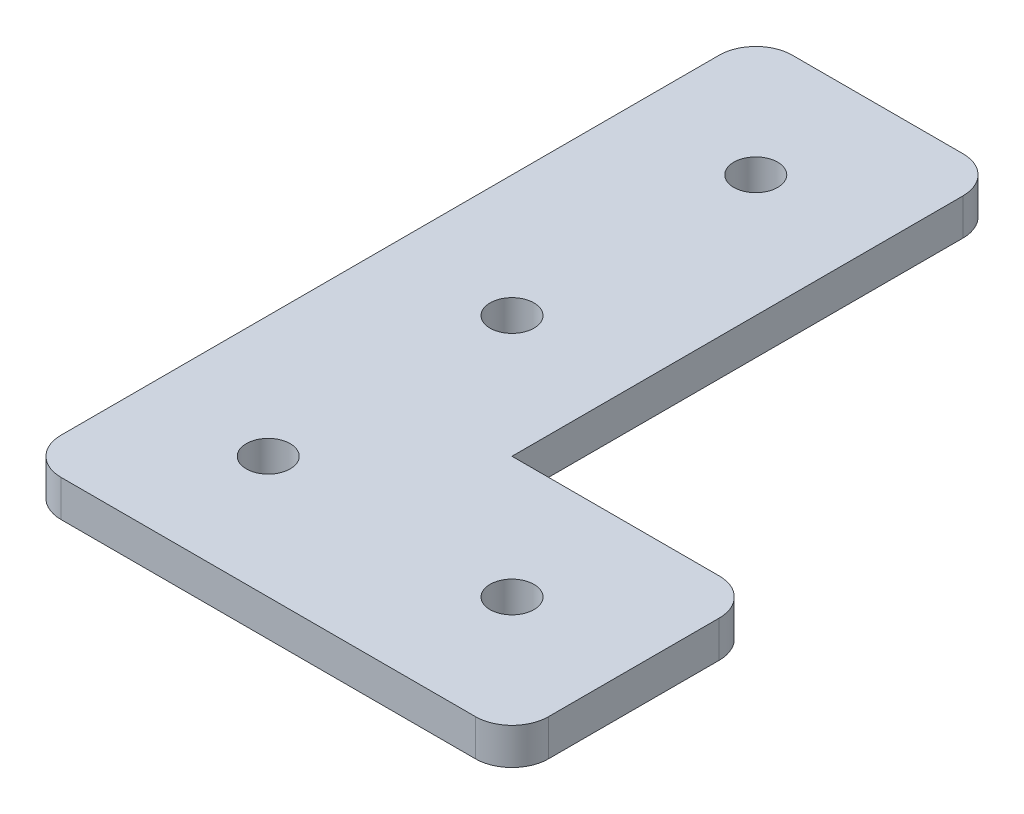
ISO-10303-21;
HEADER;
FILE_DESCRIPTION(('STEP AP214'),'2;1');
FILE_NAME('part.step','',(''),(''),'','','');
FILE_SCHEMA(('AUTOMOTIVE_DESIGN { 1 0 10303 214 1 1 1 1 }'));
ENDSEC;
DATA;
#1=APPLICATION_CONTEXT('core data for automotive mechanical design processes');
#2=APPLICATION_PROTOCOL_DEFINITION('international standard','automotive_design',2000,#1);
#3=PRODUCT_CONTEXT('',#1,'mechanical');
#4=PRODUCT('Part','Part','',(#3));
#5=PRODUCT_RELATED_PRODUCT_CATEGORY('part','',(#4));
#6=PRODUCT_DEFINITION_FORMATION('','',#4);
#7=PRODUCT_DEFINITION_CONTEXT('part definition',#1,'design');
#8=PRODUCT_DEFINITION('design','',#6,#7);
#9=PRODUCT_DEFINITION_SHAPE('','',#8);
#10=(LENGTH_UNIT() NAMED_UNIT(*) SI_UNIT(.MILLI.,.METRE.));
#11=(NAMED_UNIT(*) PLANE_ANGLE_UNIT() SI_UNIT($,.RADIAN.));
#12=(NAMED_UNIT(*) SI_UNIT($,.STERADIAN.) SOLID_ANGLE_UNIT());
#13=UNCERTAINTY_MEASURE_WITH_UNIT(LENGTH_MEASURE(1.E-05),#10,'distance_accuracy_value','');
#14=(GEOMETRIC_REPRESENTATION_CONTEXT(3) GLOBAL_UNCERTAINTY_ASSIGNED_CONTEXT((#13)) GLOBAL_UNIT_ASSIGNED_CONTEXT((#10,
#11,#12)) REPRESENTATION_CONTEXT('',''));
#15=CARTESIAN_POINT('',(0.,0.,0.));
#16=DIRECTION('',(0.,0.,1.));
#17=DIRECTION('',(1.,0.,0.));
#18=AXIS2_PLACEMENT_3D('',#15,#16,#17);
#19=CARTESIAN_POINT('',(-20.,3.,0.));
#20=DIRECTION('',(-1.,0.,0.));
#21=DIRECTION('',(0.,0.,1.));
#22=AXIS2_PLACEMENT_3D('',#19,#20,#21);
#23=PLANE('',#22);
#24=DIRECTION('',(0.,0.,-1.));
#25=VECTOR('',#24,1.);
#26=CARTESIAN_POINT('',(-20.,3.,0.));
#27=LINE('',#26,#25);
#28=CARTESIAN_POINT('',(-20.,3.,7.));
#29=VERTEX_POINT('',#28);
#30=CARTESIAN_POINT('',(-20.,3.,-47.));
#31=VERTEX_POINT('',#30);
#32=EDGE_CURVE('E303',#29,#31,#27,.T.);
#33=ORIENTED_EDGE('',*,*,#32,.T.);
#34=DIRECTION('',(0.,-1.,0.));
#35=VECTOR('',#34,1.);
#36=CARTESIAN_POINT('',(-20.,0.,-47.));
#37=LINE('',#36,#35);
#38=CARTESIAN_POINT('',(-20.,0.,-47.));
#39=VERTEX_POINT('',#38);
#40=EDGE_CURVE('E209',#31,#39,#37,.T.);
#41=ORIENTED_EDGE('',*,*,#40,.T.);
#42=DIRECTION('',(0.,0.,-1.));
#43=VECTOR('',#42,1.);
#44=CARTESIAN_POINT('',(-20.,0.,0.));
#45=LINE('',#44,#43);
#46=CARTESIAN_POINT('',(-20.,0.,7.));
#47=VERTEX_POINT('',#46);
#48=EDGE_CURVE('E177',#47,#39,#45,.T.);
#49=ORIENTED_EDGE('',*,*,#48,.F.);
#50=DIRECTION('',(0.,-1.,0.));
#51=VECTOR('',#50,1.);
#52=CARTESIAN_POINT('',(-20.,3.,7.));
#53=LINE('',#52,#51);
#54=EDGE_CURVE('E143',#47,#29,#53,.F.);
#55=ORIENTED_EDGE('',*,*,#54,.T.);
#56=EDGE_LOOP('',(#33,#41,#49,#55));
#57=FACE_BOUND('',#56,.T.);
#58=ADVANCED_FACE('F46',(#57),#23,.T.);
#59=CARTESIAN_POINT('',(0.,3.,10.));
#60=DIRECTION('',(0.,0.,-1.));
#61=DIRECTION('',(-1.,0.,0.));
#62=AXIS2_PLACEMENT_3D('',#59,#60,#61);
#63=PLANE('',#62);
#64=DIRECTION('',(1.,0.,0.));
#65=VECTOR('',#64,1.);
#66=CARTESIAN_POINT('',(0.,0.,10.));
#67=LINE('',#66,#65);
#68=CARTESIAN_POINT('',(-17.,0.,10.));
#69=VERTEX_POINT('',#68);
#70=CARTESIAN_POINT('',(17.,0.,10.));
#71=VERTEX_POINT('',#70);
#72=EDGE_CURVE('E185',#69,#71,#67,.T.);
#73=ORIENTED_EDGE('',*,*,#72,.T.);
#74=DIRECTION('',(0.,-1.,0.));
#75=VECTOR('',#74,1.);
#76=CARTESIAN_POINT('',(17.,3.,10.));
#77=LINE('',#76,#75);
#78=CARTESIAN_POINT('',(17.,3.,10.));
#79=VERTEX_POINT('',#78);
#80=EDGE_CURVE('E11',#71,#79,#77,.F.);
#81=ORIENTED_EDGE('',*,*,#80,.T.);
#82=DIRECTION('',(1.,0.,0.));
#83=VECTOR('',#82,1.);
#84=CARTESIAN_POINT('',(0.,3.,10.));
#85=LINE('',#84,#83);
#86=CARTESIAN_POINT('',(-17.,3.,10.));
#87=VERTEX_POINT('',#86);
#88=EDGE_CURVE('E160',#87,#79,#85,.T.);
#89=ORIENTED_EDGE('',*,*,#88,.F.);
#90=DIRECTION('',(0.,-1.,0.));
#91=VECTOR('',#90,1.);
#92=CARTESIAN_POINT('',(-17.,0.,10.));
#93=LINE('',#92,#91);
#94=EDGE_CURVE('E54',#87,#69,#93,.T.);
#95=ORIENTED_EDGE('',*,*,#94,.T.);
#96=EDGE_LOOP('',(#73,#81,#89,#95));
#97=FACE_BOUND('',#96,.T.);
#98=ADVANCED_FACE('F270',(#97),#63,.F.);
#99=CARTESIAN_POINT('',(20.,3.,0.));
#100=DIRECTION('',(-1.,0.,0.));
#101=DIRECTION('',(0.,0.,1.));
#102=AXIS2_PLACEMENT_3D('',#99,#100,#101);
#103=PLANE('',#102);
#104=DIRECTION('',(0.,0.,-1.));
#105=VECTOR('',#104,1.);
#106=CARTESIAN_POINT('',(20.,0.,0.));
#107=LINE('',#106,#105);
#108=CARTESIAN_POINT('',(20.,0.,7.));
#109=VERTEX_POINT('',#108);
#110=CARTESIAN_POINT('',(20.,0.,-7.));
#111=VERTEX_POINT('',#110);
#112=EDGE_CURVE('E188',#109,#111,#107,.T.);
#113=ORIENTED_EDGE('',*,*,#112,.T.);
#114=DIRECTION('',(0.,-1.,0.));
#115=VECTOR('',#114,1.);
#116=CARTESIAN_POINT('',(20.,3.,-7.));
#117=LINE('',#116,#115);
#118=CARTESIAN_POINT('',(20.,3.,-7.));
#119=VERTEX_POINT('',#118);
#120=EDGE_CURVE('E259',#111,#119,#117,.F.);
#121=ORIENTED_EDGE('',*,*,#120,.T.);
#122=DIRECTION('',(0.,0.,-1.));
#123=VECTOR('',#122,1.);
#124=CARTESIAN_POINT('',(20.,3.,0.));
#125=LINE('',#124,#123);
#126=CARTESIAN_POINT('',(20.,3.,7.));
#127=VERTEX_POINT('',#126);
#128=EDGE_CURVE('E152',#127,#119,#125,.T.);
#129=ORIENTED_EDGE('',*,*,#128,.F.);
#130=DIRECTION('',(0.,-1.,0.));
#131=VECTOR('',#130,1.);
#132=CARTESIAN_POINT('',(20.,3.,7.));
#133=LINE('',#132,#131);
#134=EDGE_CURVE('E254',#127,#109,#133,.T.);
#135=ORIENTED_EDGE('',*,*,#134,.T.);
#136=EDGE_LOOP('',(#113,#121,#129,#135));
#137=FACE_BOUND('',#136,.T.);
#138=ADVANCED_FACE('F282',(#137),#103,.F.);
#139=CARTESIAN_POINT('',(0.,3.,-10.));
#140=DIRECTION('',(0.,0.,-1.));
#141=DIRECTION('',(-1.,0.,0.));
#142=AXIS2_PLACEMENT_3D('',#139,#140,#141);
#143=PLANE('',#142);
#144=DIRECTION('',(1.,0.,0.));
#145=VECTOR('',#144,1.);
#146=CARTESIAN_POINT('',(0.,3.,-10.));
#147=LINE('',#146,#145);
#148=CARTESIAN_POINT('',(0.,3.,-10.));
#149=VERTEX_POINT('',#148);
#150=CARTESIAN_POINT('',(17.,3.,-10.));
#151=VERTEX_POINT('',#150);
#152=EDGE_CURVE('E131',#149,#151,#147,.T.);
#153=ORIENTED_EDGE('',*,*,#152,.T.);
#154=DIRECTION('',(0.,-1.,0.));
#155=VECTOR('',#154,1.);
#156=CARTESIAN_POINT('',(17.,0.,-10.));
#157=LINE('',#156,#155);
#158=CARTESIAN_POINT('',(17.,0.,-10.));
#159=VERTEX_POINT('',#158);
#160=EDGE_CURVE('E252',#151,#159,#157,.T.);
#161=ORIENTED_EDGE('',*,*,#160,.T.);
#162=DIRECTION('',(1.,0.,0.));
#163=VECTOR('',#162,1.);
#164=CARTESIAN_POINT('',(0.,0.,-10.));
#165=LINE('',#164,#163);
#166=CARTESIAN_POINT('',(0.,0.,-10.));
#167=VERTEX_POINT('',#166);
#168=EDGE_CURVE('E137',#167,#159,#165,.T.);
#169=ORIENTED_EDGE('',*,*,#168,.F.);
#170=DIRECTION('',(0.,-1.,0.));
#171=VECTOR('',#170,1.);
#172=CARTESIAN_POINT('',(0.,3.,-10.));
#173=LINE('',#172,#171);
#174=EDGE_CURVE('E134',#149,#167,#173,.T.);
#175=ORIENTED_EDGE('',*,*,#174,.F.);
#176=EDGE_LOOP('',(#153,#161,#169,#175));
#177=FACE_BOUND('',#176,.T.);
#178=ADVANCED_FACE('F132',(#177),#143,.T.);
#179=CARTESIAN_POINT('',(0.,3.,0.));
#180=DIRECTION('',(-1.,0.,0.));
#181=DIRECTION('',(0.,0.,1.));
#182=AXIS2_PLACEMENT_3D('',#179,#180,#181);
#183=PLANE('',#182);
#184=DIRECTION('',(0.,0.,-1.));
#185=VECTOR('',#184,1.);
#186=CARTESIAN_POINT('',(0.,0.,0.));
#187=LINE('',#186,#185);
#188=CARTESIAN_POINT('',(0.,0.,-47.));
#189=VERTEX_POINT('',#188);
#190=EDGE_CURVE('E194',#167,#189,#187,.T.);
#191=ORIENTED_EDGE('',*,*,#190,.T.);
#192=DIRECTION('',(0.,-1.,0.));
#193=VECTOR('',#192,1.);
#194=CARTESIAN_POINT('',(0.,3.,-47.));
#195=LINE('',#194,#193);
#196=CARTESIAN_POINT('',(0.,3.,-47.));
#197=VERTEX_POINT('',#196);
#198=EDGE_CURVE('E64',#189,#197,#195,.F.);
#199=ORIENTED_EDGE('',*,*,#198,.T.);
#200=DIRECTION('',(0.,0.,-1.));
#201=VECTOR('',#200,1.);
#202=CARTESIAN_POINT('',(0.,3.,0.));
#203=LINE('',#202,#201);
#204=EDGE_CURVE('E145',#149,#197,#203,.T.);
#205=ORIENTED_EDGE('',*,*,#204,.F.);
#206=ORIENTED_EDGE('',*,*,#174,.T.);
#207=EDGE_LOOP('',(#191,#199,#205,#206));
#208=FACE_BOUND('',#207,.T.);
#209=ADVANCED_FACE('F144',(#208),#183,.F.);
#210=CARTESIAN_POINT('',(10.,3.,0.));
#211=DIRECTION('',(0.,-1.,0.));
#212=DIRECTION('',(0.,0.,-1.));
#213=AXIS2_PLACEMENT_3D('',#210,#211,#212);
#214=CYLINDRICAL_SURFACE('',#213,1.8);
#215=CARTESIAN_POINT('',(10.,3.,0.));
#216=DIRECTION('',(0.,1.,0.));
#217=DIRECTION('',(0.,0.,1.));
#218=AXIS2_PLACEMENT_3D('',#215,#216,#217);
#219=CIRCLE('',#218,1.8);
#220=CARTESIAN_POINT('',(10.,3.,1.8));
#221=VERTEX_POINT('',#220);
#222=EDGE_CURVE('E162',#221,#221,#219,.T.);
#223=ORIENTED_EDGE('',*,*,#222,.T.);
#224=EDGE_LOOP('',(#223));
#225=FACE_BOUND('',#224,.T.);
#226=CARTESIAN_POINT('',(10.,0.,0.));
#227=DIRECTION('',(0.,1.,0.));
#228=DIRECTION('',(0.,0.,1.));
#229=AXIS2_PLACEMENT_3D('',#226,#227,#228);
#230=CIRCLE('',#229,1.8);
#231=CARTESIAN_POINT('',(10.,0.,1.8));
#232=VERTEX_POINT('',#231);
#233=EDGE_CURVE('E200',#232,#232,#230,.T.);
#234=ORIENTED_EDGE('',*,*,#233,.F.);
#235=EDGE_LOOP('',(#234));
#236=FACE_BOUND('',#235,.T.);
#237=ADVANCED_FACE('F403',(#225,#236),#214,.F.);
#238=CARTESIAN_POINT('',(0.,3.,-50.));
#239=DIRECTION('',(0.,0.,1.));
#240=DIRECTION('',(1.,0.,0.));
#241=AXIS2_PLACEMENT_3D('',#238,#239,#240);
#242=PLANE('',#241);
#243=DIRECTION('',(-1.,0.,0.));
#244=VECTOR('',#243,1.);
#245=CARTESIAN_POINT('',(0.,0.,-50.));
#246=LINE('',#245,#244);
#247=CARTESIAN_POINT('',(-3.,0.,-50.));
#248=VERTEX_POINT('',#247);
#249=CARTESIAN_POINT('',(-17.,0.,-50.));
#250=VERTEX_POINT('',#249);
#251=EDGE_CURVE('E191',#248,#250,#246,.T.);
#252=ORIENTED_EDGE('',*,*,#251,.T.);
#253=DIRECTION('',(0.,-1.,0.));
#254=VECTOR('',#253,1.);
#255=CARTESIAN_POINT('',(-17.,3.,-50.));
#256=LINE('',#255,#254);
#257=CARTESIAN_POINT('',(-17.,3.,-50.));
#258=VERTEX_POINT('',#257);
#259=EDGE_CURVE('E232',#250,#258,#256,.F.);
#260=ORIENTED_EDGE('',*,*,#259,.T.);
#261=DIRECTION('',(-1.,0.,0.));
#262=VECTOR('',#261,1.);
#263=CARTESIAN_POINT('',(0.,3.,-50.));
#264=LINE('',#263,#262);
#265=CARTESIAN_POINT('',(-3.,3.,-50.));
#266=VERTEX_POINT('',#265);
#267=EDGE_CURVE('E146',#266,#258,#264,.T.);
#268=ORIENTED_EDGE('',*,*,#267,.F.);
#269=DIRECTION('',(0.,-1.,0.));
#270=VECTOR('',#269,1.);
#271=CARTESIAN_POINT('',(-3.,3.,-50.));
#272=LINE('',#271,#270);
#273=EDGE_CURVE('E230',#266,#248,#272,.T.);
#274=ORIENTED_EDGE('',*,*,#273,.T.);
#275=EDGE_LOOP('',(#252,#260,#268,#274));
#276=FACE_BOUND('',#275,.T.);
#277=ADVANCED_FACE('F294',(#276),#242,.F.);
#278=CARTESIAN_POINT('',(-10.,3.,-40.));
#279=DIRECTION('',(0.,-1.,0.));
#280=DIRECTION('',(0.,0.,-1.));
#281=AXIS2_PLACEMENT_3D('',#278,#279,#280);
#282=CYLINDRICAL_SURFACE('',#281,1.8);
#283=CARTESIAN_POINT('',(-10.,3.,-40.));
#284=DIRECTION('',(0.,1.,0.));
#285=DIRECTION('',(0.,0.,1.));
#286=AXIS2_PLACEMENT_3D('',#283,#284,#285);
#287=CIRCLE('',#286,1.8);
#288=CARTESIAN_POINT('',(-10.,3.,-38.2));
#289=VERTEX_POINT('',#288);
#290=EDGE_CURVE('E301',#289,#289,#287,.T.);
#291=ORIENTED_EDGE('',*,*,#290,.T.);
#292=EDGE_LOOP('',(#291));
#293=FACE_BOUND('',#292,.T.);
#294=CARTESIAN_POINT('',(-10.,0.,-40.));
#295=DIRECTION('',(0.,1.,0.));
#296=DIRECTION('',(0.,0.,1.));
#297=AXIS2_PLACEMENT_3D('',#294,#295,#296);
#298=CIRCLE('',#297,1.8);
#299=CARTESIAN_POINT('',(-10.,0.,-38.2));
#300=VERTEX_POINT('',#299);
#301=EDGE_CURVE('E175',#300,#300,#298,.T.);
#302=ORIENTED_EDGE('',*,*,#301,.F.);
#303=EDGE_LOOP('',(#302));
#304=FACE_BOUND('',#303,.T.);
#305=ADVANCED_FACE('F324',(#293,#304),#282,.F.);
#306=CARTESIAN_POINT('',(-10.,3.,-20.));
#307=DIRECTION('',(0.,-1.,0.));
#308=DIRECTION('',(0.,0.,-1.));
#309=AXIS2_PLACEMENT_3D('',#306,#307,#308);
#310=CYLINDRICAL_SURFACE('',#309,1.8);
#311=CARTESIAN_POINT('',(-10.,3.,-20.));
#312=DIRECTION('',(0.,1.,0.));
#313=DIRECTION('',(0.,0.,1.));
#314=AXIS2_PLACEMENT_3D('',#311,#312,#313);
#315=CIRCLE('',#314,1.8);
#316=CARTESIAN_POINT('',(-10.,3.,-18.2));
#317=VERTEX_POINT('',#316);
#318=EDGE_CURVE('E206',#317,#317,#315,.T.);
#319=ORIENTED_EDGE('',*,*,#318,.T.);
#320=EDGE_LOOP('',(#319));
#321=FACE_BOUND('',#320,.T.);
#322=CARTESIAN_POINT('',(-10.,0.,-20.));
#323=DIRECTION('',(0.,1.,0.));
#324=DIRECTION('',(0.,0.,1.));
#325=AXIS2_PLACEMENT_3D('',#322,#323,#324);
#326=CIRCLE('',#325,1.8);
#327=CARTESIAN_POINT('',(-10.,0.,-18.2));
#328=VERTEX_POINT('',#327);
#329=EDGE_CURVE('E168',#328,#328,#326,.T.);
#330=ORIENTED_EDGE('',*,*,#329,.F.);
#331=EDGE_LOOP('',(#330));
#332=FACE_BOUND('',#331,.T.);
#333=ADVANCED_FACE('F316',(#321,#332),#310,.F.);
#334=CARTESIAN_POINT('',(-10.,3.,0.));
#335=DIRECTION('',(0.,-1.,0.));
#336=DIRECTION('',(0.,0.,-1.));
#337=AXIS2_PLACEMENT_3D('',#334,#335,#336);
#338=CYLINDRICAL_SURFACE('',#337,1.8);
#339=CARTESIAN_POINT('',(-10.,3.,0.));
#340=DIRECTION('',(0.,1.,0.));
#341=DIRECTION('',(0.,0.,1.));
#342=AXIS2_PLACEMENT_3D('',#339,#340,#341);
#343=CIRCLE('',#342,1.8);
#344=CARTESIAN_POINT('',(-10.,3.,1.8));
#345=VERTEX_POINT('',#344);
#346=EDGE_CURVE('E142',#345,#345,#343,.T.);
#347=ORIENTED_EDGE('',*,*,#346,.T.);
#348=EDGE_LOOP('',(#347));
#349=FACE_BOUND('',#348,.T.);
#350=CARTESIAN_POINT('',(-10.,0.,0.));
#351=DIRECTION('',(0.,1.,0.));
#352=DIRECTION('',(0.,0.,1.));
#353=AXIS2_PLACEMENT_3D('',#350,#351,#352);
#354=CIRCLE('',#353,1.8);
#355=CARTESIAN_POINT('',(-10.,0.,1.8));
#356=VERTEX_POINT('',#355);
#357=EDGE_CURVE('E201',#356,#356,#354,.T.);
#358=ORIENTED_EDGE('',*,*,#357,.F.);
#359=EDGE_LOOP('',(#358));
#360=FACE_BOUND('',#359,.T.);
#361=ADVANCED_FACE('F321',(#349,#360),#338,.F.);
#362=CARTESIAN_POINT('',(0.,3.,0.));
#363=DIRECTION('',(0.,1.,0.));
#364=DIRECTION('',(0.,0.,1.));
#365=AXIS2_PLACEMENT_3D('',#362,#363,#364);
#366=PLANE('',#365);
#367=ORIENTED_EDGE('',*,*,#318,.F.);
#368=EDGE_LOOP('',(#367));
#369=FACE_BOUND('',#368,.T.);
#370=ORIENTED_EDGE('',*,*,#290,.F.);
#371=EDGE_LOOP('',(#370));
#372=FACE_BOUND('',#371,.T.);
#373=ORIENTED_EDGE('',*,*,#267,.T.);
#374=CARTESIAN_POINT('',(-17.,3.,-47.));
#375=DIRECTION('',(0.,1.,0.));
#376=DIRECTION('',(0.,0.,1.));
#377=AXIS2_PLACEMENT_3D('',#374,#375,#376);
#378=CIRCLE('',#377,3.);
#379=EDGE_CURVE('E249',#258,#31,#378,.T.);
#380=ORIENTED_EDGE('',*,*,#379,.T.);
#381=ORIENTED_EDGE('',*,*,#32,.F.);
#382=CARTESIAN_POINT('',(-17.,3.,7.));
#383=DIRECTION('',(0.,1.,0.));
#384=DIRECTION('',(0.,0.,1.));
#385=AXIS2_PLACEMENT_3D('',#382,#383,#384);
#386=CIRCLE('',#385,3.);
#387=EDGE_CURVE('E237',#29,#87,#386,.T.);
#388=ORIENTED_EDGE('',*,*,#387,.T.);
#389=ORIENTED_EDGE('',*,*,#88,.T.);
#390=CARTESIAN_POINT('',(17.,3.,7.));
#391=DIRECTION('',(0.,1.,0.));
#392=DIRECTION('',(0.,0.,1.));
#393=AXIS2_PLACEMENT_3D('',#390,#391,#392);
#394=CIRCLE('',#393,3.);
#395=EDGE_CURVE('E239',#79,#127,#394,.T.);
#396=ORIENTED_EDGE('',*,*,#395,.T.);
#397=ORIENTED_EDGE('',*,*,#128,.T.);
#398=CARTESIAN_POINT('',(17.,3.,-7.));
#399=DIRECTION('',(0.,1.,0.));
#400=DIRECTION('',(0.,0.,1.));
#401=AXIS2_PLACEMENT_3D('',#398,#399,#400);
#402=CIRCLE('',#401,3.);
#403=EDGE_CURVE('E66',#119,#151,#402,.T.);
#404=ORIENTED_EDGE('',*,*,#403,.T.);
#405=ORIENTED_EDGE('',*,*,#152,.F.);
#406=ORIENTED_EDGE('',*,*,#204,.T.);
#407=CARTESIAN_POINT('',(-3.,3.,-47.));
#408=DIRECTION('',(0.,1.,0.));
#409=DIRECTION('',(0.,0.,1.));
#410=AXIS2_PLACEMENT_3D('',#407,#408,#409);
#411=CIRCLE('',#410,3.);
#412=EDGE_CURVE('E245',#197,#266,#411,.T.);
#413=ORIENTED_EDGE('',*,*,#412,.T.);
#414=EDGE_LOOP('',(#373,#380,#381,#388,#389,#396,#397,#404,#405,#406,#413));
#415=FACE_BOUND('',#414,.T.);
#416=ORIENTED_EDGE('',*,*,#222,.F.);
#417=EDGE_LOOP('',(#416));
#418=FACE_BOUND('',#417,.T.);
#419=ORIENTED_EDGE('',*,*,#346,.F.);
#420=EDGE_LOOP('',(#419));
#421=FACE_BOUND('',#420,.T.);
#422=ADVANCED_FACE('F151',(#369,#372,#415,#418,#421),#366,.T.);
#423=CARTESIAN_POINT('',(0.,0.,0.));
#424=DIRECTION('',(0.,1.,0.));
#425=DIRECTION('',(0.,0.,1.));
#426=AXIS2_PLACEMENT_3D('',#423,#424,#425);
#427=PLANE('',#426);
#428=ORIENTED_EDGE('',*,*,#329,.T.);
#429=EDGE_LOOP('',(#428));
#430=FACE_BOUND('',#429,.T.);
#431=ORIENTED_EDGE('',*,*,#301,.T.);
#432=EDGE_LOOP('',(#431));
#433=FACE_BOUND('',#432,.T.);
#434=ORIENTED_EDGE('',*,*,#48,.T.);
#435=CARTESIAN_POINT('',(-17.,0.,-47.));
#436=DIRECTION('',(0.,1.,0.));
#437=DIRECTION('',(0.,0.,1.));
#438=AXIS2_PLACEMENT_3D('',#435,#436,#437);
#439=CIRCLE('',#438,3.);
#440=EDGE_CURVE('E228',#39,#250,#439,.F.);
#441=ORIENTED_EDGE('',*,*,#440,.T.);
#442=ORIENTED_EDGE('',*,*,#251,.F.);
#443=CARTESIAN_POINT('',(-3.,0.,-47.));
#444=DIRECTION('',(0.,1.,0.));
#445=DIRECTION('',(0.,0.,1.));
#446=AXIS2_PLACEMENT_3D('',#443,#444,#445);
#447=CIRCLE('',#446,3.);
#448=EDGE_CURVE('E224',#248,#189,#447,.F.);
#449=ORIENTED_EDGE('',*,*,#448,.T.);
#450=ORIENTED_EDGE('',*,*,#190,.F.);
#451=ORIENTED_EDGE('',*,*,#168,.T.);
#452=CARTESIAN_POINT('',(17.,0.,-7.));
#453=DIRECTION('',(0.,1.,0.));
#454=DIRECTION('',(0.,0.,1.));
#455=AXIS2_PLACEMENT_3D('',#452,#453,#454);
#456=CIRCLE('',#455,3.);
#457=EDGE_CURVE('E219',#159,#111,#456,.F.);
#458=ORIENTED_EDGE('',*,*,#457,.T.);
#459=ORIENTED_EDGE('',*,*,#112,.F.);
#460=CARTESIAN_POINT('',(17.,0.,7.));
#461=DIRECTION('',(0.,1.,0.));
#462=DIRECTION('',(0.,0.,1.));
#463=AXIS2_PLACEMENT_3D('',#460,#461,#462);
#464=CIRCLE('',#463,3.);
#465=EDGE_CURVE('E220',#109,#71,#464,.F.);
#466=ORIENTED_EDGE('',*,*,#465,.T.);
#467=ORIENTED_EDGE('',*,*,#72,.F.);
#468=CARTESIAN_POINT('',(-17.,0.,7.));
#469=DIRECTION('',(0.,1.,0.));
#470=DIRECTION('',(0.,0.,1.));
#471=AXIS2_PLACEMENT_3D('',#468,#469,#470);
#472=CIRCLE('',#471,3.);
#473=EDGE_CURVE('E212',#69,#47,#472,.F.);
#474=ORIENTED_EDGE('',*,*,#473,.T.);
#475=EDGE_LOOP('',(#434,#441,#442,#449,#450,#451,#458,#459,#466,#467,#474));
#476=FACE_BOUND('',#475,.T.);
#477=ORIENTED_EDGE('',*,*,#233,.T.);
#478=EDGE_LOOP('',(#477));
#479=FACE_BOUND('',#478,.T.);
#480=ORIENTED_EDGE('',*,*,#357,.T.);
#481=EDGE_LOOP('',(#480));
#482=FACE_BOUND('',#481,.T.);
#483=ADVANCED_FACE('F272',(#430,#433,#476,#479,#482),#427,.F.);
#484=CARTESIAN_POINT('',(-17.,3.,-47.));
#485=DIRECTION('',(0.,1.,0.));
#486=DIRECTION('',(0.,0.,1.));
#487=AXIS2_PLACEMENT_3D('',#484,#485,#486);
#488=CYLINDRICAL_SURFACE('',#487,3.);
#489=ORIENTED_EDGE('',*,*,#379,.F.);
#490=ORIENTED_EDGE('',*,*,#259,.F.);
#491=ORIENTED_EDGE('',*,*,#440,.F.);
#492=ORIENTED_EDGE('',*,*,#40,.F.);
#493=EDGE_LOOP('',(#489,#490,#491,#492));
#494=FACE_BOUND('',#493,.T.);
#495=ADVANCED_FACE('F299',(#494),#488,.T.);
#496=CARTESIAN_POINT('',(-3.,3.,-47.));
#497=DIRECTION('',(0.,-1.,0.));
#498=DIRECTION('',(0.,0.,-1.));
#499=AXIS2_PLACEMENT_3D('',#496,#497,#498);
#500=CYLINDRICAL_SURFACE('',#499,3.);
#501=ORIENTED_EDGE('',*,*,#412,.F.);
#502=ORIENTED_EDGE('',*,*,#198,.F.);
#503=ORIENTED_EDGE('',*,*,#448,.F.);
#504=ORIENTED_EDGE('',*,*,#273,.F.);
#505=EDGE_LOOP('',(#501,#502,#503,#504));
#506=FACE_BOUND('',#505,.T.);
#507=ADVANCED_FACE('F290',(#506),#500,.T.);
#508=CARTESIAN_POINT('',(17.,3.,-7.));
#509=DIRECTION('',(0.,1.,0.));
#510=DIRECTION('',(0.,0.,1.));
#511=AXIS2_PLACEMENT_3D('',#508,#509,#510);
#512=CYLINDRICAL_SURFACE('',#511,3.);
#513=ORIENTED_EDGE('',*,*,#403,.F.);
#514=ORIENTED_EDGE('',*,*,#120,.F.);
#515=ORIENTED_EDGE('',*,*,#457,.F.);
#516=ORIENTED_EDGE('',*,*,#160,.F.);
#517=EDGE_LOOP('',(#513,#514,#515,#516));
#518=FACE_BOUND('',#517,.T.);
#519=ADVANCED_FACE('F288',(#518),#512,.T.);
#520=CARTESIAN_POINT('',(17.,3.,7.));
#521=DIRECTION('',(0.,-1.,0.));
#522=DIRECTION('',(0.,0.,-1.));
#523=AXIS2_PLACEMENT_3D('',#520,#521,#522);
#524=CYLINDRICAL_SURFACE('',#523,3.);
#525=ORIENTED_EDGE('',*,*,#395,.F.);
#526=ORIENTED_EDGE('',*,*,#80,.F.);
#527=ORIENTED_EDGE('',*,*,#465,.F.);
#528=ORIENTED_EDGE('',*,*,#134,.F.);
#529=EDGE_LOOP('',(#525,#526,#527,#528));
#530=FACE_BOUND('',#529,.T.);
#531=ADVANCED_FACE('F278',(#530),#524,.T.);
#532=CARTESIAN_POINT('',(-17.,3.,7.));
#533=DIRECTION('',(0.,1.,0.));
#534=DIRECTION('',(0.,0.,1.));
#535=AXIS2_PLACEMENT_3D('',#532,#533,#534);
#536=CYLINDRICAL_SURFACE('',#535,3.);
#537=ORIENTED_EDGE('',*,*,#387,.F.);
#538=ORIENTED_EDGE('',*,*,#54,.F.);
#539=ORIENTED_EDGE('',*,*,#473,.F.);
#540=ORIENTED_EDGE('',*,*,#94,.F.);
#541=EDGE_LOOP('',(#537,#538,#539,#540));
#542=FACE_BOUND('',#541,.T.);
#543=ADVANCED_FACE('F48',(#542),#536,.T.);
#544=CLOSED_SHELL('',(#58,#98,#138,#178,#209,#237,#277,#305,#333,#361,#422,#483,#495,#507,#519,
#531,#543));
#545=MANIFOLD_SOLID_BREP('B2',#544);
#546=ADVANCED_BREP_SHAPE_REPRESENTATION('',(#18,#545),#14);
#547=SHAPE_DEFINITION_REPRESENTATION(#9,#546);
ENDSEC;
END-ISO-10303-21;
